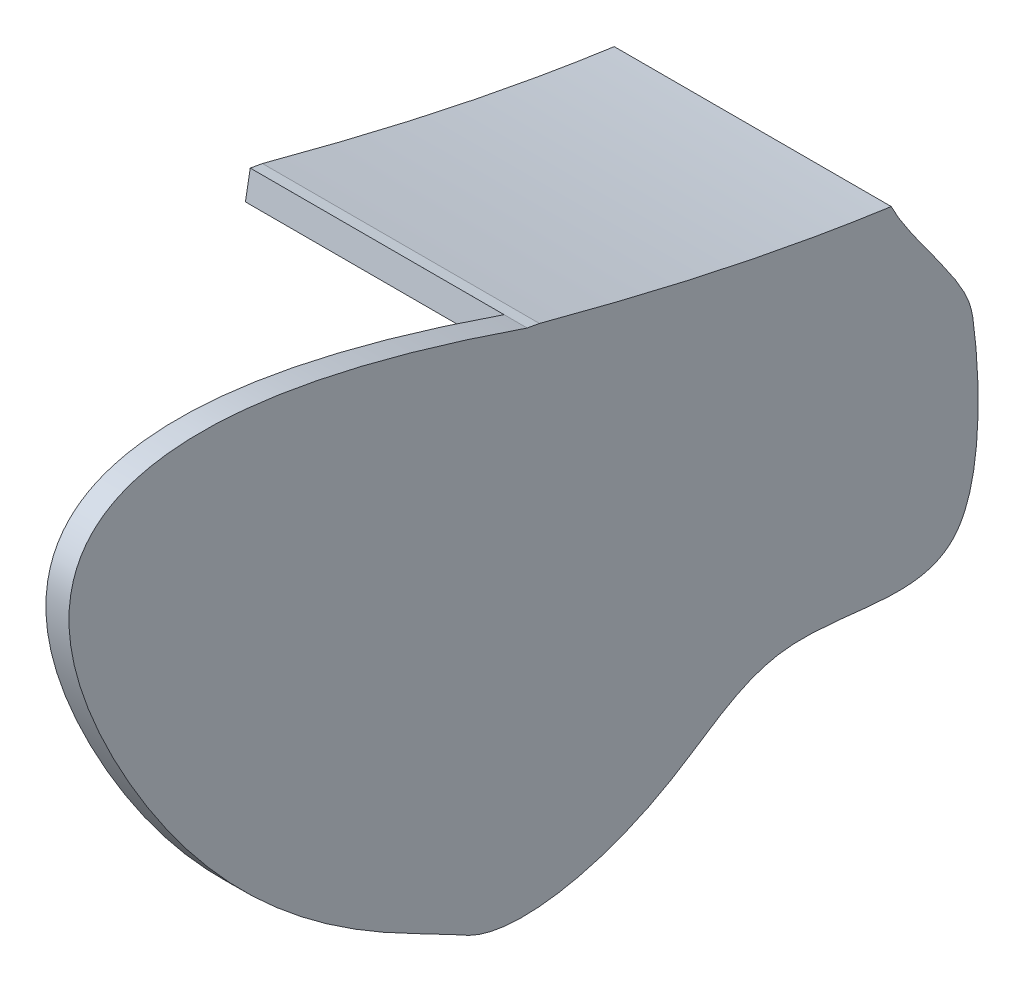
ISO-10303-21;
HEADER;
FILE_DESCRIPTION(('STEP AP214'),'2;1');
FILE_NAME('part.step','',(''),(''),'','','');
FILE_SCHEMA(('AUTOMOTIVE_DESIGN { 1 0 10303 214 1 1 1 1 }'));
ENDSEC;
DATA;
#1=APPLICATION_CONTEXT('core data for automotive mechanical design processes');
#2=APPLICATION_PROTOCOL_DEFINITION('international standard','automotive_design',2000,#1);
#3=PRODUCT_CONTEXT('',#1,'mechanical');
#4=PRODUCT('Part','Part','',(#3));
#5=PRODUCT_RELATED_PRODUCT_CATEGORY('part','',(#4));
#6=PRODUCT_DEFINITION_FORMATION('','',#4);
#7=PRODUCT_DEFINITION_CONTEXT('part definition',#1,'design');
#8=PRODUCT_DEFINITION('design','',#6,#7);
#9=PRODUCT_DEFINITION_SHAPE('','',#8);
#10=(LENGTH_UNIT() NAMED_UNIT(*) SI_UNIT(.MILLI.,.METRE.));
#11=(NAMED_UNIT(*) PLANE_ANGLE_UNIT() SI_UNIT($,.RADIAN.));
#12=(NAMED_UNIT(*) SI_UNIT($,.STERADIAN.) SOLID_ANGLE_UNIT());
#13=UNCERTAINTY_MEASURE_WITH_UNIT(LENGTH_MEASURE(1.E-05),#10,'distance_accuracy_value','');
#14=(GEOMETRIC_REPRESENTATION_CONTEXT(3) GLOBAL_UNCERTAINTY_ASSIGNED_CONTEXT((#13)) GLOBAL_UNIT_ASSIGNED_CONTEXT((#10,
#11,#12)) REPRESENTATION_CONTEXT('',''));
#15=CARTESIAN_POINT('',(0.,0.,0.));
#16=DIRECTION('',(0.,0.,1.));
#17=DIRECTION('',(1.,0.,0.));
#18=AXIS2_PLACEMENT_3D('',#15,#16,#17);
#19=CARTESIAN_POINT('',(0.,0.,0.));
#20=DIRECTION('',(-1.,0.,0.));
#21=DIRECTION('',(0.,0.,1.));
#22=AXIS2_PLACEMENT_3D('',#19,#20,#21);
#23=PLANE('',#22);
#24=DIRECTION('',(0.,-0.984307604433455,0.176461156786625));
#25=VECTOR('',#24,1.);
#26=CARTESIAN_POINT('',(0.,84.5332490600185,4.78828772816991));
#27=LINE('',#26,#25);
#28=CARTESIAN_POINT('',(0.,83.2992083685256,5.00951963470176));
#29=VERTEX_POINT('',#28);
#30=CARTESIAN_POINT('',(0.,81.2293859022452,5.38058581878658));
#31=VERTEX_POINT('',#30);
#32=EDGE_CURVE('E230',#29,#31,#27,.T.);
#33=ORIENTED_EDGE('',*,*,#32,.F.);
#34=CARTESIAN_POINT('',(0.,83.2992083685258,5.00951963470184));
#35=CARTESIAN_POINT('',(0.,79.3685971997713,3.14403238327885));
#36=CARTESIAN_POINT('',(0.,72.3367715324521,-3.36212402867376));
#37=CARTESIAN_POINT('',(0.,63.6881040295217,-4.67851046792569));
#38=CARTESIAN_POINT('',(0.,40.5346141246306,-5.600424531901));
#39=CARTESIAN_POINT('',(0.,50.5739856203236,16.4186105462933));
#40=CARTESIAN_POINT('',(0.,36.7826556840587,32.8725949783162));
#41=CARTESIAN_POINT('',(0.,34.4593842756066,47.6394193354163));
#42=CARTESIAN_POINT('',(0.,40.1338484510541,56.338800129186));
#43=CARTESIAN_POINT('',(0.,49.1153951414013,78.2341927410765));
#44=CARTESIAN_POINT('',(0.,96.3525329585087,102.698921653381));
#45=CARTESIAN_POINT('',(0.,106.598547485504,88.0667159801616));
#46=CARTESIAN_POINT('',(0.,91.7546126804746,45.0698599617244));
#47=B_SPLINE_CURVE_WITH_KNOTS('',3,(#34,#35,#36,#37,#38,#39,#40,#41,#42,#43,#44,#45,#46),
.UNSPECIFIED.,.F.,.F.,(4,1,1,1,1,1,1,1,1,1,4),(0.,0.0685946865472461,0.0875065258864135,
0.189118393391675,0.32124035529613,0.403936790146976,0.595103525728518,0.635405369241626,
0.806955225278057,0.85814667392529,1.),.UNSPECIFIED.);
#48=CARTESIAN_POINT('',(0.,91.7546126804746,45.0698599617244));
#49=VERTEX_POINT('',#48);
#50=EDGE_CURVE('E125',#29,#49,#47,.T.);
#51=ORIENTED_EDGE('',*,*,#50,.T.);
#52=DIRECTION('',(0.,-0.984307604433455,0.176461156786625));
#53=VECTOR('',#52,1.);
#54=CARTESIAN_POINT('',(0.,91.7547009802717,45.0698441318311));
#55=LINE('',#54,#53);
#56=CARTESIAN_POINT('',(0.,88.7962855176558,45.6002122936103));
#57=VERTEX_POINT('',#56);
#58=EDGE_CURVE('E236',#49,#57,#55,.T.);
#59=ORIENTED_EDGE('',*,*,#58,.T.);
#60=CARTESIAN_POINT('',(0.,90.6834467352145,53.4558721786458));
#61=CARTESIAN_POINT('',(0.,86.680580038786,37.047064255139));
#62=CARTESIAN_POINT('',(0.,83.8210866155175,24.1232264315164));
#63=CARTESIAN_POINT('',(0.,81.1308717498339,5.73255045661642));
#64=B_SPLINE_CURVE_WITH_KNOTS('',3,(#60,#61,#62,#63),.UNSPECIFIED.,.F.,.F.,(4,4),(0.,1.),.UNSPECIFIED.);
#65=CARTESIAN_POINT('',(0.,84.5536266646926,26.0134924277997));
#66=VERTEX_POINT('',#65);
#67=EDGE_CURVE('E158',#57,#66,#64,.T.);
#68=ORIENTED_EDGE('',*,*,#67,.T.);
#69=DIRECTION('',(0.,0.176461156786626,0.984307604433455));
#70=VECTOR('',#69,1.);
#71=CARTESIAN_POINT('',(0.,88.0877945594689,45.7272265861865));
#72=LINE('',#71,#70);
#73=CARTESIAN_POINT('',(0.,82.5247065783013,14.6960925751085));
#74=VERTEX_POINT('',#73);
#75=EDGE_CURVE('E244',#74,#66,#72,.T.);
#76=ORIENTED_EDGE('',*,*,#75,.F.);
#77=CARTESIAN_POINT('',(0.,81.1308717498339,5.73255045661642));
#78=VERTEX_POINT('',#77);
#79=EDGE_CURVE('E54',#74,#78,#64,.T.);
#80=ORIENTED_EDGE('',*,*,#79,.T.);
#81=DIRECTION('',(0.,0.26953872418825,-0.962989551429802));
#82=VECTOR('',#81,1.);
#83=CARTESIAN_POINT('',(0.,76.7245805907551,21.4750466768883));
#84=LINE('',#83,#82);
#85=EDGE_CURVE('E155',#78,#31,#84,.T.);
#86=ORIENTED_EDGE('',*,*,#85,.T.);
#87=EDGE_LOOP('',(#33,#51,#59,#68,#76,#80,#86));
#88=FACE_BOUND('',#87,.T.);
#89=ADVANCED_FACE('F40',(#88),#23,.T.);
#90=CARTESIAN_POINT('',(2.54,0.,0.));
#91=DIRECTION('',(-1.,0.,0.));
#92=DIRECTION('',(0.,0.,1.));
#93=AXIS2_PLACEMENT_3D('',#90,#91,#92);
#94=PLANE('',#93);
#95=CARTESIAN_POINT('',(2.54,83.2992083685258,5.00951963470184));
#96=CARTESIAN_POINT('',(2.54,79.3685971997713,3.14403238327885));
#97=CARTESIAN_POINT('',(2.54,72.3367715324521,-3.36212402867376));
#98=CARTESIAN_POINT('',(2.54,63.6881040295217,-4.67851046792569));
#99=CARTESIAN_POINT('',(2.54,40.5346141246306,-5.600424531901));
#100=CARTESIAN_POINT('',(2.54,50.5739856203236,16.4186105462933));
#101=CARTESIAN_POINT('',(2.54,36.7826556840587,32.8725949783162));
#102=CARTESIAN_POINT('',(2.54,34.4593842756066,47.6394193354163));
#103=CARTESIAN_POINT('',(2.54,40.1338484510541,56.338800129186));
#104=CARTESIAN_POINT('',(2.54,49.1153951414013,78.2341927410765));
#105=CARTESIAN_POINT('',(2.54,96.3525329585087,102.698921653381));
#106=CARTESIAN_POINT('',(2.54,106.598547485504,88.0667159801616));
#107=CARTESIAN_POINT('',(2.54,91.7546126804746,45.0698599617244));
#108=B_SPLINE_CURVE_WITH_KNOTS('',3,(#95,#96,#97,#98,#99,#100,#101,#102,#103,#104,#105,#106,
#107),.UNSPECIFIED.,.F.,.F.,(4,1,1,1,1,1,1,1,1,1,4),(0.,0.0685946865472461,0.0875065258864135,
0.189118393391675,0.32124035529613,0.403936790146976,0.595103525728518,0.635405369241626,
0.806955225278057,0.85814667392529,1.),.UNSPECIFIED.);
#109=CARTESIAN_POINT('',(2.54,83.2992083685256,5.00951963470176));
#110=VERTEX_POINT('',#109);
#111=CARTESIAN_POINT('',(2.54,91.7546126804746,45.0698599617244));
#112=VERTEX_POINT('',#111);
#113=EDGE_CURVE('E128',#110,#112,#108,.T.);
#114=ORIENTED_EDGE('',*,*,#113,.F.);
#115=CARTESIAN_POINT('',(2.54,91.8665546157289,45.0494489357037));
#116=CARTESIAN_POINT('',(2.54,90.5238424344429,40.025208830504));
#117=CARTESIAN_POINT('',(2.54,87.1003275516629,26.8102839776144));
#118=CARTESIAN_POINT('',(2.54,84.4717365420223,13.3672878163539));
#119=CARTESIAN_POINT('',(2.54,83.2992083685256,5.00951963470176));
#120=B_SPLINE_CURVE_WITH_KNOTS('',3,(#115,#116,#117,#118,#119),.UNSPECIFIED.,.F.,.F.,(4,1,4),
(0.,0.380899761761039,1.),.UNSPECIFIED.);
#121=CARTESIAN_POINT('',(2.54,91.5135944959716,43.7249422265249));
#122=VERTEX_POINT('',#121);
#123=EDGE_CURVE('E169',#122,#110,#120,.T.);
#124=ORIENTED_EDGE('',*,*,#123,.F.);
#125=DIRECTION('',(0.,0.176461156786611,0.984307604433457));
#126=VECTOR('',#125,1.);
#127=CARTESIAN_POINT('',(2.54,81.0693195628815,-14.5336537536998));
#128=LINE('',#127,#126);
#129=CARTESIAN_POINT('',(2.54,91.7546539872708,45.0695820029351));
#130=VERTEX_POINT('',#129);
#131=EDGE_CURVE('E139',#122,#130,#128,.T.);
#132=ORIENTED_EDGE('',*,*,#131,.T.);
#133=DIRECTION('',(0.,0.146993373548875,-0.989137476861898));
#134=VECTOR('',#133,1.);
#135=CARTESIAN_POINT('',(2.54,97.8628948140794,3.96643719018347));
#136=LINE('',#135,#134);
#137=EDGE_CURVE('E119',#112,#130,#136,.T.);
#138=ORIENTED_EDGE('',*,*,#137,.F.);
#139=EDGE_LOOP('',(#114,#124,#132,#138));
#140=FACE_BOUND('',#139,.T.);
#141=ADVANCED_FACE('F137',(#140),#94,.F.);
#142=CARTESIAN_POINT('',(-27.9400013387204,91.7547009802717,45.0698441318311));
#143=DIRECTION('',(-1.,0.,0.));
#144=DIRECTION('',(0.,0.,1.));
#145=AXIS2_PLACEMENT_3D('',#142,#143,#144);
#146=PLANE('',#145);
#147=DIRECTION('',(0.,-0.984307604433455,0.176461156786625));
#148=VECTOR('',#147,1.);
#149=CARTESIAN_POINT('',(-27.9400013387204,91.7547009802717,45.0698441318311));
#150=LINE('',#149,#148);
#151=CARTESIAN_POINT('',(-27.9400013387204,91.7546126804746,45.0698599617244));
#152=VERTEX_POINT('',#151);
#153=CARTESIAN_POINT('',(-27.9400013387204,88.7962855176369,45.6002122935303));
#154=VERTEX_POINT('',#153);
#155=EDGE_CURVE('E251',#152,#154,#150,.T.);
#156=ORIENTED_EDGE('',*,*,#155,.F.);
#157=DIRECTION('',(0.,0.146993373548875,-0.989137476861898));
#158=VECTOR('',#157,1.);
#159=CARTESIAN_POINT('',(-27.9400013387204,91.7546168899864,45.0698316353733));
#160=LINE('',#159,#158);
#161=CARTESIAN_POINT('',(-27.9400013387204,91.7546539872708,45.0695820029351));
#162=VERTEX_POINT('',#161);
#163=EDGE_CURVE('E148',#152,#162,#160,.T.);
#164=ORIENTED_EDGE('',*,*,#163,.T.);
#165=DIRECTION('',(0.,-0.176461156786626,-0.984307604433455));
#166=VECTOR('',#165,1.);
#167=CARTESIAN_POINT('',(-27.9400013387204,91.7547009802717,45.0698441318311));
#168=LINE('',#167,#166);
#169=CARTESIAN_POINT('',(-27.9400013387204,91.5135944959716,43.7249422265249));
#170=VERTEX_POINT('',#169);
#171=EDGE_CURVE('E62',#162,#170,#168,.T.);
#172=ORIENTED_EDGE('',*,*,#171,.T.);
#173=CARTESIAN_POINT('',(-27.9400013387204,91.8665546157289,45.0494489357037));
#174=CARTESIAN_POINT('',(-27.9400013387204,90.5238424344429,40.025208830504));
#175=CARTESIAN_POINT('',(-27.9400013387204,87.1003275516629,26.8102839776144));
#176=CARTESIAN_POINT('',(-27.9400013387204,84.4717365420223,13.3672878163539));
#177=CARTESIAN_POINT('',(-27.9400013387204,83.2992083685256,5.00951963470176));
#178=B_SPLINE_CURVE_WITH_KNOTS('',3,(#173,#174,#175,#176,#177),.UNSPECIFIED.,.F.,.F.,(4,1,4),
(0.,0.380899761761039,1.),.UNSPECIFIED.);
#179=CARTESIAN_POINT('',(-27.9400013387204,83.2992083685256,5.00951963470176));
#180=VERTEX_POINT('',#179);
#181=EDGE_CURVE('E171',#170,#180,#178,.T.);
#182=ORIENTED_EDGE('',*,*,#181,.T.);
#183=DIRECTION('',(0.,-0.984307604433455,0.176461156786625));
#184=VECTOR('',#183,1.);
#185=CARTESIAN_POINT('',(-27.9400013387204,84.5332490600185,4.78828772816992));
#186=LINE('',#185,#184);
#187=CARTESIAN_POINT('',(-27.9400013387204,81.2293859022452,5.38058581878659));
#188=VERTEX_POINT('',#187);
#189=EDGE_CURVE('E237',#180,#188,#186,.T.);
#190=ORIENTED_EDGE('',*,*,#189,.T.);
#191=DIRECTION('',(0.,0.26953872418825,-0.962989551429802));
#192=VECTOR('',#191,1.);
#193=CARTESIAN_POINT('',(-27.9400013387204,71.6921999041959,39.4543928156233));
#194=LINE('',#193,#192);
#195=CARTESIAN_POINT('',(-27.9400013387204,81.1308717498339,5.73255045661642));
#196=VERTEX_POINT('',#195);
#197=EDGE_CURVE('E172',#196,#188,#194,.T.);
#198=ORIENTED_EDGE('',*,*,#197,.F.);
#199=CARTESIAN_POINT('',(-27.9400013387204,90.6834467352145,53.4558721786458));
#200=CARTESIAN_POINT('',(-27.9400013387204,86.680580038786,37.047064255139));
#201=CARTESIAN_POINT('',(-27.9400013387204,83.8210866155175,24.1232264315164));
#202=CARTESIAN_POINT('',(-27.9400013387204,81.1308717498339,5.73255045661642));
#203=B_SPLINE_CURVE_WITH_KNOTS('',3,(#199,#200,#201,#202),.UNSPECIFIED.,.F.,.F.,(4,4),(0.,1.),.UNSPECIFIED.);
#204=CARTESIAN_POINT('',(-27.9400013387204,82.5247065783014,14.6960925751085));
#205=VERTEX_POINT('',#204);
#206=EDGE_CURVE('E273',#205,#196,#203,.T.);
#207=ORIENTED_EDGE('',*,*,#206,.F.);
#208=DIRECTION('',(0.,-0.176461156786626,-0.984307604433455));
#209=VECTOR('',#208,1.);
#210=CARTESIAN_POINT('',(-27.9400013387204,88.0877945594689,45.7272265861865));
#211=LINE('',#210,#209);
#212=CARTESIAN_POINT('',(-27.9400013387204,84.553626664693,26.013492427802));
#213=VERTEX_POINT('',#212);
#214=EDGE_CURVE('E242',#213,#205,#211,.T.);
#215=ORIENTED_EDGE('',*,*,#214,.F.);
#216=EDGE_CURVE('E266',#154,#213,#203,.T.);
#217=ORIENTED_EDGE('',*,*,#216,.F.);
#218=EDGE_LOOP('',(#156,#164,#172,#182,#190,#198,#207,#215,#217));
#219=FACE_BOUND('',#218,.T.);
#220=ADVANCED_FACE('F213',(#219),#146,.T.);
#221=CARTESIAN_POINT('',(-27.9400013387204,91.7547009802717,45.0698441318311));
#222=DIRECTION('',(0.,0.176461156786625,0.984307604433454));
#223=DIRECTION('',(0.,-0.984307604433455,0.176461156786625));
#224=AXIS2_PLACEMENT_3D('',#221,#222,#223);
#225=PLANE('',#224);
#226=ORIENTED_EDGE('',*,*,#58,.F.);
#227=DIRECTION('',(-1.,0.,0.));
#228=VECTOR('',#227,1.);
#229=CARTESIAN_POINT('',(2.54,91.7546126804746,45.0698599617244));
#230=LINE('',#229,#228);
#231=EDGE_CURVE('E122',#49,#152,#230,.T.);
#232=ORIENTED_EDGE('',*,*,#231,.T.);
#233=ORIENTED_EDGE('',*,*,#155,.T.);
#234=DIRECTION('',(-1.,0.,0.));
#235=VECTOR('',#234,1.);
#236=CARTESIAN_POINT('',(2.54,88.7962855176558,45.6002122936103));
#237=LINE('',#236,#235);
#238=EDGE_CURVE('E269',#57,#154,#237,.T.);
#239=ORIENTED_EDGE('',*,*,#238,.F.);
#240=EDGE_LOOP('',(#226,#232,#233,#239));
#241=FACE_BOUND('',#240,.T.);
#242=ADVANCED_FACE('F204',(#241),#225,.T.);
#243=CARTESIAN_POINT('',(0.,81.0693195628805,-14.5336537537008));
#244=DIRECTION('',(0.,-0.984307604433455,0.176461156786626));
#245=DIRECTION('',(0.,-0.176461156786626,-0.984307604433455));
#246=AXIS2_PLACEMENT_3D('',#243,#244,#245);
#247=PLANE('',#246);
#248=DIRECTION('',(-1.,0.,0.));
#249=VECTOR('',#248,1.);
#250=CARTESIAN_POINT('',(0.,91.7546539872708,45.0695820029351));
#251=LINE('',#250,#249);
#252=EDGE_CURVE('E12',#130,#162,#251,.T.);
#253=ORIENTED_EDGE('',*,*,#252,.F.);
#254=ORIENTED_EDGE('',*,*,#131,.F.);
#255=DIRECTION('',(1.,0.,0.));
#256=VECTOR('',#255,1.);
#257=CARTESIAN_POINT('',(-27.9400013387204,91.5135944964744,43.7249422293297));
#258=LINE('',#257,#256);
#259=EDGE_CURVE('E253',#122,#170,#258,.F.);
#260=ORIENTED_EDGE('',*,*,#259,.T.);
#261=ORIENTED_EDGE('',*,*,#171,.F.);
#262=EDGE_LOOP('',(#253,#254,#260,#261));
#263=FACE_BOUND('',#262,.T.);
#264=ADVANCED_FACE('F200',(#263),#247,.F.);
#265=CARTESIAN_POINT('',(2.54,90.6834467352145,53.4558721786458));
#266=CARTESIAN_POINT('',(2.54,86.680580038786,37.047064255139));
#267=CARTESIAN_POINT('',(2.54,83.8210866155175,24.1232264315164));
#268=CARTESIAN_POINT('',(2.54,81.1308717498339,5.73255045661642));
#269=B_SPLINE_CURVE_WITH_KNOTS('',3,(#265,#266,#267,#268),.UNSPECIFIED.,.F.,.F.,(4,4),(0.,1.),.UNSPECIFIED.);
#270=DIRECTION('',(-1.,0.,0.));
#271=VECTOR('',#270,1.);
#272=SURFACE_OF_LINEAR_EXTRUSION('',#269,#271);
#273=DIRECTION('',(-1.,0.,0.));
#274=VECTOR('',#273,1.);
#275=CARTESIAN_POINT('',(2.54,81.1308717498339,5.73255045661642));
#276=LINE('',#275,#274);
#277=EDGE_CURVE('E166',#78,#196,#276,.T.);
#278=ORIENTED_EDGE('',*,*,#277,.F.);
#279=ORIENTED_EDGE('',*,*,#79,.F.);
#280=DIRECTION('',(-1.,0.,0.));
#281=VECTOR('',#280,1.);
#282=CARTESIAN_POINT('',(2.54,82.5247065783014,14.6960925751085));
#283=LINE('',#282,#281);
#284=EDGE_CURVE('E258',#74,#205,#283,.T.);
#285=ORIENTED_EDGE('',*,*,#284,.T.);
#286=ORIENTED_EDGE('',*,*,#206,.T.);
#287=EDGE_LOOP('',(#278,#279,#285,#286));
#288=FACE_BOUND('',#287,.T.);
#289=ADVANCED_FACE('F203',(#288),#272,.F.);
#290=CARTESIAN_POINT('',(2.54,81.6640200716156,3.82775453245265));
#291=DIRECTION('',(0.,0.962989551429802,0.26953872418825));
#292=DIRECTION('',(0.,-0.26953872418825,0.962989551429802));
#293=AXIS2_PLACEMENT_3D('',#290,#291,#292);
#294=PLANE('',#293);
#295=ORIENTED_EDGE('',*,*,#85,.F.);
#296=ORIENTED_EDGE('',*,*,#277,.T.);
#297=ORIENTED_EDGE('',*,*,#197,.T.);
#298=DIRECTION('',(1.,0.,0.));
#299=VECTOR('',#298,1.);
#300=CARTESIAN_POINT('',(-27.9400013387204,81.2293859022452,5.38058581878659));
#301=LINE('',#300,#299);
#302=EDGE_CURVE('E47',#188,#31,#301,.T.);
#303=ORIENTED_EDGE('',*,*,#302,.T.);
#304=EDGE_LOOP('',(#295,#296,#297,#303));
#305=FACE_BOUND('',#304,.T.);
#306=ADVANCED_FACE('F197',(#305),#294,.F.);
#307=DIRECTION('',(1.,0.,0.));
#308=VECTOR('',#307,1.);
#309=SURFACE_OF_LINEAR_EXTRUSION('',#178,#308);
#310=DIRECTION('',(1.,0.,0.));
#311=VECTOR('',#310,1.);
#312=CARTESIAN_POINT('',(-27.9400013387204,83.2992083685256,5.00951963470176));
#313=LINE('',#312,#311);
#314=EDGE_CURVE('E186',#180,#29,#313,.T.);
#315=ORIENTED_EDGE('',*,*,#314,.F.);
#316=ORIENTED_EDGE('',*,*,#181,.F.);
#317=ORIENTED_EDGE('',*,*,#259,.F.);
#318=ORIENTED_EDGE('',*,*,#123,.T.);
#319=DIRECTION('',(1.,0.,0.));
#320=VECTOR('',#319,1.);
#321=CARTESIAN_POINT('',(1.27024999999999,83.2992083685256,5.00951963470176));
#322=LINE('',#321,#320);
#323=EDGE_CURVE('E131',#110,#29,#322,.F.);
#324=ORIENTED_EDGE('',*,*,#323,.T.);
#325=EDGE_LOOP('',(#315,#316,#317,#318,#324));
#326=FACE_BOUND('',#325,.T.);
#327=ADVANCED_FACE('F192',(#326),#309,.F.);
#328=ORIENTED_EDGE('',*,*,#67,.F.);
#329=ORIENTED_EDGE('',*,*,#238,.T.);
#330=ORIENTED_EDGE('',*,*,#216,.T.);
#331=DIRECTION('',(-1.,0.,0.));
#332=VECTOR('',#331,1.);
#333=CARTESIAN_POINT('',(2.54,84.553626664693,26.013492427802));
#334=LINE('',#333,#332);
#335=EDGE_CURVE('E260',#213,#66,#334,.F.);
#336=ORIENTED_EDGE('',*,*,#335,.T.);
#337=EDGE_LOOP('',(#328,#329,#330,#336));
#338=FACE_BOUND('',#337,.T.);
#339=ADVANCED_FACE('F196',(#338),#272,.F.);
#340=CARTESIAN_POINT('',(-27.9400013387204,84.5332490600185,4.78828772816992));
#341=DIRECTION('',(0.,-0.176461156786625,-0.984307604433454));
#342=DIRECTION('',(0.,0.984307604433455,-0.176461156786625));
#343=AXIS2_PLACEMENT_3D('',#340,#341,#342);
#344=PLANE('',#343);
#345=ORIENTED_EDGE('',*,*,#302,.F.);
#346=ORIENTED_EDGE('',*,*,#189,.F.);
#347=ORIENTED_EDGE('',*,*,#314,.T.);
#348=ORIENTED_EDGE('',*,*,#32,.T.);
#349=EDGE_LOOP('',(#345,#346,#347,#348));
#350=FACE_BOUND('',#349,.T.);
#351=ADVANCED_FACE('F209',(#350),#344,.T.);
#352=CARTESIAN_POINT('',(0.,77.4024131420777,-13.8762712993454));
#353=DIRECTION('',(0.,-0.984307604433455,0.176461156786626));
#354=DIRECTION('',(0.,-0.176461156786626,-0.984307604433455));
#355=AXIS2_PLACEMENT_3D('',#352,#353,#354);
#356=PLANE('',#355);
#357=ORIENTED_EDGE('',*,*,#335,.F.);
#358=ORIENTED_EDGE('',*,*,#214,.T.);
#359=ORIENTED_EDGE('',*,*,#284,.F.);
#360=ORIENTED_EDGE('',*,*,#75,.T.);
#361=EDGE_LOOP('',(#357,#358,#359,#360));
#362=FACE_BOUND('',#361,.T.);
#363=ADVANCED_FACE('F206',(#362),#356,.T.);
#364=DIRECTION('',(-1.,0.,0.));
#365=VECTOR('',#364,1.);
#366=SURFACE_OF_LINEAR_EXTRUSION('',#108,#365);
#367=ORIENTED_EDGE('',*,*,#323,.F.);
#368=ORIENTED_EDGE('',*,*,#113,.T.);
#369=EDGE_CURVE('E115',#112,#49,#230,.T.);
#370=ORIENTED_EDGE('',*,*,#369,.T.);
#371=ORIENTED_EDGE('',*,*,#50,.F.);
#372=EDGE_LOOP('',(#367,#368,#370,#371));
#373=FACE_BOUND('',#372,.T.);
#374=ADVANCED_FACE('F129',(#373),#366,.T.);
#375=CARTESIAN_POINT('',(2.54,97.8628948140794,3.96643719018347));
#376=DIRECTION('',(0.,0.989137476861898,0.146993373548875));
#377=DIRECTION('',(0.,-0.146993373548875,0.989137476861898));
#378=AXIS2_PLACEMENT_3D('',#375,#376,#377);
#379=PLANE('',#378);
#380=ORIENTED_EDGE('',*,*,#231,.F.);
#381=ORIENTED_EDGE('',*,*,#369,.F.);
#382=ORIENTED_EDGE('',*,*,#137,.T.);
#383=ORIENTED_EDGE('',*,*,#252,.T.);
#384=ORIENTED_EDGE('',*,*,#163,.F.);
#385=EDGE_LOOP('',(#380,#381,#382,#383,#384));
#386=FACE_BOUND('',#385,.T.);
#387=ADVANCED_FACE('F117',(#386),#379,.T.);
#388=CLOSED_SHELL('',(#89,#141,#220,#242,#264,#289,#306,#327,#339,#351,#363,#374,#387));
#389=MANIFOLD_SOLID_BREP('B2',#388);
#390=ADVANCED_BREP_SHAPE_REPRESENTATION('',(#18,#389),#14);
#391=SHAPE_DEFINITION_REPRESENTATION(#9,#390);
ENDSEC;
END-ISO-10303-21;
